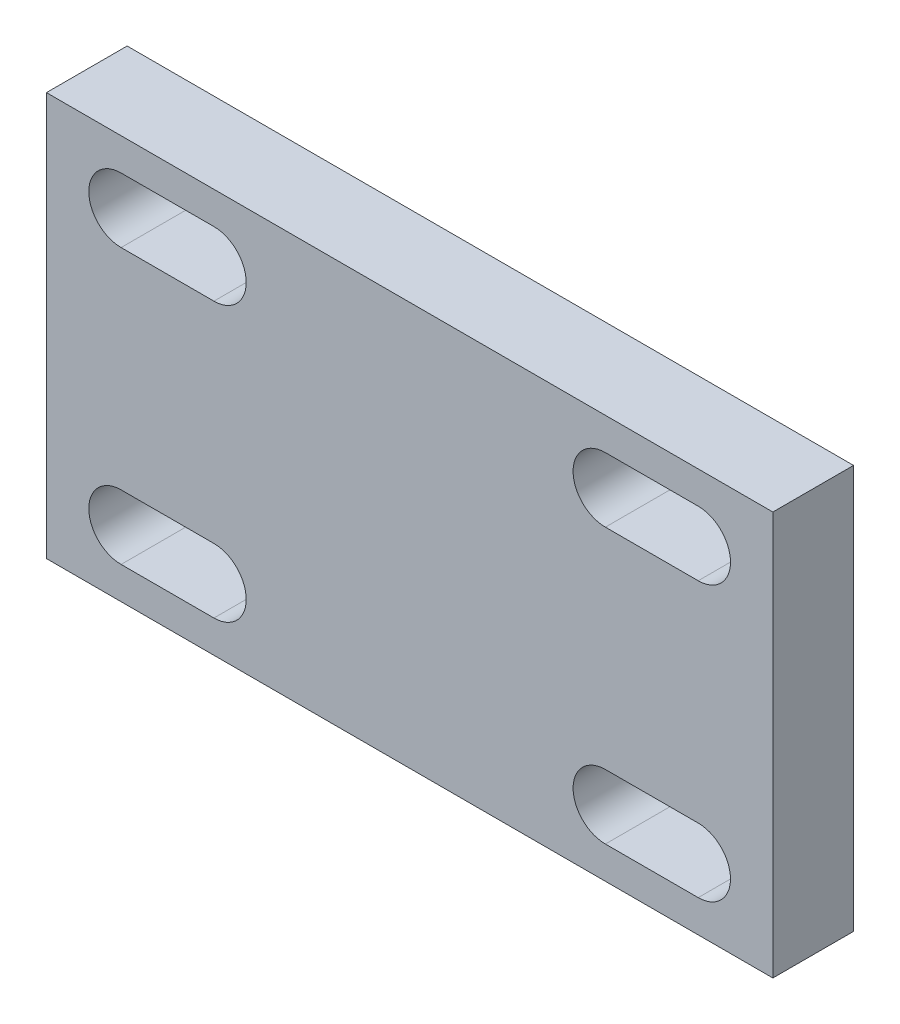
ISO-10303-21;
HEADER;
FILE_DESCRIPTION(('STEP AP214'),'2;1');
FILE_NAME('part.step','',(''),(''),'','','');
FILE_SCHEMA(('AUTOMOTIVE_DESIGN { 1 0 10303 214 1 1 1 1 }'));
ENDSEC;
DATA;
#1=APPLICATION_CONTEXT('core data for automotive mechanical design processes');
#2=APPLICATION_PROTOCOL_DEFINITION('international standard','automotive_design',2000,#1);
#3=PRODUCT_CONTEXT('',#1,'mechanical');
#4=PRODUCT('Part','Part','',(#3));
#5=PRODUCT_RELATED_PRODUCT_CATEGORY('part','',(#4));
#6=PRODUCT_DEFINITION_FORMATION('','',#4);
#7=PRODUCT_DEFINITION_CONTEXT('part definition',#1,'design');
#8=PRODUCT_DEFINITION('design','',#6,#7);
#9=PRODUCT_DEFINITION_SHAPE('','',#8);
#10=(LENGTH_UNIT() NAMED_UNIT(*) SI_UNIT(.MILLI.,.METRE.));
#11=(NAMED_UNIT(*) PLANE_ANGLE_UNIT() SI_UNIT($,.RADIAN.));
#12=(NAMED_UNIT(*) SI_UNIT($,.STERADIAN.) SOLID_ANGLE_UNIT());
#13=UNCERTAINTY_MEASURE_WITH_UNIT(LENGTH_MEASURE(1.E-05),#10,'distance_accuracy_value','');
#14=(GEOMETRIC_REPRESENTATION_CONTEXT(3) GLOBAL_UNCERTAINTY_ASSIGNED_CONTEXT((#13)) GLOBAL_UNIT_ASSIGNED_CONTEXT((#10,
#11,#12)) REPRESENTATION_CONTEXT('',''));
#15=CARTESIAN_POINT('',(0.,0.,0.));
#16=DIRECTION('',(0.,0.,1.));
#17=DIRECTION('',(1.,0.,0.));
#18=AXIS2_PLACEMENT_3D('',#15,#16,#17);
#19=CARTESIAN_POINT('',(0.,0.,10.));
#20=DIRECTION('',(0.,0.,-1.));
#21=DIRECTION('',(-1.,0.,0.));
#22=AXIS2_PLACEMENT_3D('',#19,#20,#21);
#23=PLANE('',#22);
#24=CARTESIAN_POINT('',(9.25,8.,10.));
#25=DIRECTION('',(0.,0.,1.));
#26=DIRECTION('',(1.,0.,0.));
#27=AXIS2_PLACEMENT_3D('',#24,#25,#26);
#28=CIRCLE('',#27,4.);
#29=CARTESIAN_POINT('',(9.25,12.,10.));
#30=VERTEX_POINT('',#29);
#31=CARTESIAN_POINT('',(9.25,4.,10.));
#32=VERTEX_POINT('',#31);
#33=EDGE_CURVE('E207',#30,#32,#28,.T.);
#34=ORIENTED_EDGE('',*,*,#33,.F.);
#35=DIRECTION('',(-1.,0.,0.));
#36=VECTOR('',#35,1.);
#37=CARTESIAN_POINT('',(9.25,12.,10.));
#38=LINE('',#37,#36);
#39=CARTESIAN_POINT('',(20.75,12.,10.));
#40=VERTEX_POINT('',#39);
#41=EDGE_CURVE('E215',#40,#30,#38,.T.);
#42=ORIENTED_EDGE('',*,*,#41,.F.);
#43=CARTESIAN_POINT('',(20.75,8.,10.));
#44=DIRECTION('',(0.,0.,1.));
#45=DIRECTION('',(1.,0.,0.));
#46=AXIS2_PLACEMENT_3D('',#43,#44,#45);
#47=CIRCLE('',#46,4.);
#48=CARTESIAN_POINT('',(20.75,4.,10.));
#49=VERTEX_POINT('',#48);
#50=EDGE_CURVE('E212',#49,#40,#47,.T.);
#51=ORIENTED_EDGE('',*,*,#50,.F.);
#52=DIRECTION('',(1.,0.,0.));
#53=VECTOR('',#52,1.);
#54=CARTESIAN_POINT('',(9.25,4.,10.));
#55=LINE('',#54,#53);
#56=EDGE_CURVE('E209',#32,#49,#55,.T.);
#57=ORIENTED_EDGE('',*,*,#56,.F.);
#58=EDGE_LOOP('',(#34,#42,#51,#57));
#59=FACE_BOUND('',#58,.T.);
#60=CARTESIAN_POINT('',(9.25,42.,10.));
#61=DIRECTION('',(0.,0.,1.));
#62=DIRECTION('',(1.,0.,0.));
#63=AXIS2_PLACEMENT_3D('',#60,#61,#62);
#64=CIRCLE('',#63,4.);
#65=CARTESIAN_POINT('',(9.25,46.,10.));
#66=VERTEX_POINT('',#65);
#67=CARTESIAN_POINT('',(9.25,38.,10.));
#68=VERTEX_POINT('',#67);
#69=EDGE_CURVE('E269',#66,#68,#64,.T.);
#70=ORIENTED_EDGE('',*,*,#69,.F.);
#71=DIRECTION('',(-1.,0.,0.));
#72=VECTOR('',#71,1.);
#73=CARTESIAN_POINT('',(9.25,46.,10.));
#74=LINE('',#73,#72);
#75=CARTESIAN_POINT('',(20.75,46.,10.));
#76=VERTEX_POINT('',#75);
#77=EDGE_CURVE('E277',#76,#66,#74,.T.);
#78=ORIENTED_EDGE('',*,*,#77,.F.);
#79=CARTESIAN_POINT('',(20.75,42.,10.));
#80=DIRECTION('',(0.,0.,1.));
#81=DIRECTION('',(1.,0.,0.));
#82=AXIS2_PLACEMENT_3D('',#79,#80,#81);
#83=CIRCLE('',#82,4.);
#84=CARTESIAN_POINT('',(20.75,38.,10.));
#85=VERTEX_POINT('',#84);
#86=EDGE_CURVE('E274',#85,#76,#83,.T.);
#87=ORIENTED_EDGE('',*,*,#86,.F.);
#88=DIRECTION('',(1.,0.,0.));
#89=VECTOR('',#88,1.);
#90=CARTESIAN_POINT('',(9.25,38.,10.));
#91=LINE('',#90,#89);
#92=EDGE_CURVE('E271',#68,#85,#91,.T.);
#93=ORIENTED_EDGE('',*,*,#92,.F.);
#94=EDGE_LOOP('',(#70,#78,#87,#93));
#95=FACE_BOUND('',#94,.T.);
#96=DIRECTION('',(0.,-1.,0.));
#97=VECTOR('',#96,1.);
#98=CARTESIAN_POINT('',(0.,0.,10.));
#99=LINE('',#98,#97);
#100=CARTESIAN_POINT('',(0.,50.,10.));
#101=VERTEX_POINT('',#100);
#102=CARTESIAN_POINT('',(0.,0.,10.));
#103=VERTEX_POINT('',#102);
#104=EDGE_CURVE('E300',#101,#103,#99,.T.);
#105=ORIENTED_EDGE('',*,*,#104,.T.);
#106=DIRECTION('',(1.,0.,0.));
#107=VECTOR('',#106,1.);
#108=CARTESIAN_POINT('',(0.,0.,10.));
#109=LINE('',#108,#107);
#110=CARTESIAN_POINT('',(90.,0.,10.));
#111=VERTEX_POINT('',#110);
#112=EDGE_CURVE('E303',#103,#111,#109,.T.);
#113=ORIENTED_EDGE('',*,*,#112,.T.);
#114=DIRECTION('',(0.,1.,0.));
#115=VECTOR('',#114,1.);
#116=CARTESIAN_POINT('',(90.,0.,10.));
#117=LINE('',#116,#115);
#118=CARTESIAN_POINT('',(90.,50.,10.));
#119=VERTEX_POINT('',#118);
#120=EDGE_CURVE('E306',#111,#119,#117,.T.);
#121=ORIENTED_EDGE('',*,*,#120,.T.);
#122=DIRECTION('',(-1.,0.,0.));
#123=VECTOR('',#122,1.);
#124=CARTESIAN_POINT('',(0.,50.,10.));
#125=LINE('',#124,#123);
#126=EDGE_CURVE('E308',#119,#101,#125,.T.);
#127=ORIENTED_EDGE('',*,*,#126,.T.);
#128=EDGE_LOOP('',(#105,#113,#121,#127));
#129=FACE_BOUND('',#128,.T.);
#130=CARTESIAN_POINT('',(80.75,42.,10.));
#131=DIRECTION('',(0.,0.,1.));
#132=DIRECTION('',(1.,0.,0.));
#133=AXIS2_PLACEMENT_3D('',#130,#131,#132);
#134=CIRCLE('',#133,4.);
#135=CARTESIAN_POINT('',(80.75,38.,10.));
#136=VERTEX_POINT('',#135);
#137=CARTESIAN_POINT('',(80.75,46.,10.));
#138=VERTEX_POINT('',#137);
#139=EDGE_CURVE('E238',#136,#138,#134,.T.);
#140=ORIENTED_EDGE('',*,*,#139,.F.);
#141=DIRECTION('',(1.,0.,0.));
#142=VECTOR('',#141,1.);
#143=CARTESIAN_POINT('',(80.75,38.,10.));
#144=LINE('',#143,#142);
#145=CARTESIAN_POINT('',(69.25,38.,10.));
#146=VERTEX_POINT('',#145);
#147=EDGE_CURVE('E246',#146,#136,#144,.T.);
#148=ORIENTED_EDGE('',*,*,#147,.F.);
#149=CARTESIAN_POINT('',(69.25,42.,10.));
#150=DIRECTION('',(0.,0.,1.));
#151=DIRECTION('',(1.,0.,0.));
#152=AXIS2_PLACEMENT_3D('',#149,#150,#151);
#153=CIRCLE('',#152,4.);
#154=CARTESIAN_POINT('',(69.25,46.,10.));
#155=VERTEX_POINT('',#154);
#156=EDGE_CURVE('E243',#155,#146,#153,.T.);
#157=ORIENTED_EDGE('',*,*,#156,.F.);
#158=DIRECTION('',(-1.,0.,0.));
#159=VECTOR('',#158,1.);
#160=CARTESIAN_POINT('',(80.75,46.,10.));
#161=LINE('',#160,#159);
#162=EDGE_CURVE('E240',#138,#155,#161,.T.);
#163=ORIENTED_EDGE('',*,*,#162,.F.);
#164=EDGE_LOOP('',(#140,#148,#157,#163));
#165=FACE_BOUND('',#164,.T.);
#166=CARTESIAN_POINT('',(69.25,7.99999999999999,10.));
#167=DIRECTION('',(0.,0.,1.));
#168=DIRECTION('',(1.,0.,0.));
#169=AXIS2_PLACEMENT_3D('',#166,#167,#168);
#170=CIRCLE('',#169,4.);
#171=CARTESIAN_POINT('',(69.25,12.,10.));
#172=VERTEX_POINT('',#171);
#173=CARTESIAN_POINT('',(69.25,3.99999999999998,10.));
#174=VERTEX_POINT('',#173);
#175=EDGE_CURVE('E171',#172,#174,#170,.T.);
#176=ORIENTED_EDGE('',*,*,#175,.F.);
#177=DIRECTION('',(-1.,0.,0.));
#178=VECTOR('',#177,1.);
#179=CARTESIAN_POINT('',(69.25,12.,10.));
#180=LINE('',#179,#178);
#181=CARTESIAN_POINT('',(80.75,12.,10.));
#182=VERTEX_POINT('',#181);
#183=EDGE_CURVE('E193',#182,#172,#180,.T.);
#184=ORIENTED_EDGE('',*,*,#183,.F.);
#185=CARTESIAN_POINT('',(80.75,7.99999999999998,10.));
#186=DIRECTION('',(0.,0.,1.));
#187=DIRECTION('',(1.,0.,0.));
#188=AXIS2_PLACEMENT_3D('',#185,#186,#187);
#189=CIRCLE('',#188,4.);
#190=CARTESIAN_POINT('',(80.75,3.99999999999998,10.));
#191=VERTEX_POINT('',#190);
#192=EDGE_CURVE('E191',#191,#182,#189,.T.);
#193=ORIENTED_EDGE('',*,*,#192,.F.);
#194=DIRECTION('',(1.,0.,0.));
#195=VECTOR('',#194,1.);
#196=CARTESIAN_POINT('',(69.25,3.99999999999998,10.));
#197=LINE('',#196,#195);
#198=EDGE_CURVE('E179',#174,#191,#197,.T.);
#199=ORIENTED_EDGE('',*,*,#198,.F.);
#200=EDGE_LOOP('',(#176,#184,#193,#199));
#201=FACE_BOUND('',#200,.T.);
#202=ADVANCED_FACE('F34',(#59,#95,#129,#165,#201),#23,.F.);
#203=CARTESIAN_POINT('',(0.,0.,0.));
#204=DIRECTION('',(0.,0.,-1.));
#205=DIRECTION('',(-1.,0.,0.));
#206=AXIS2_PLACEMENT_3D('',#203,#204,#205);
#207=PLANE('',#206);
#208=DIRECTION('',(0.,-1.,0.));
#209=VECTOR('',#208,1.);
#210=CARTESIAN_POINT('',(0.,0.,0.));
#211=LINE('',#210,#209);
#212=CARTESIAN_POINT('',(0.,50.,0.));
#213=VERTEX_POINT('',#212);
#214=CARTESIAN_POINT('',(0.,0.,0.));
#215=VERTEX_POINT('',#214);
#216=EDGE_CURVE('E299',#213,#215,#211,.T.);
#217=ORIENTED_EDGE('',*,*,#216,.F.);
#218=DIRECTION('',(-1.,0.,0.));
#219=VECTOR('',#218,1.);
#220=CARTESIAN_POINT('',(0.,50.,0.));
#221=LINE('',#220,#219);
#222=CARTESIAN_POINT('',(90.,50.,0.));
#223=VERTEX_POINT('',#222);
#224=EDGE_CURVE('E304',#223,#213,#221,.T.);
#225=ORIENTED_EDGE('',*,*,#224,.F.);
#226=DIRECTION('',(0.,1.,0.));
#227=VECTOR('',#226,1.);
#228=CARTESIAN_POINT('',(90.,0.,0.));
#229=LINE('',#228,#227);
#230=CARTESIAN_POINT('',(90.,0.,0.));
#231=VERTEX_POINT('',#230);
#232=EDGE_CURVE('E315',#231,#223,#229,.T.);
#233=ORIENTED_EDGE('',*,*,#232,.F.);
#234=DIRECTION('',(1.,0.,0.));
#235=VECTOR('',#234,1.);
#236=CARTESIAN_POINT('',(0.,0.,0.));
#237=LINE('',#236,#235);
#238=EDGE_CURVE('E313',#215,#231,#237,.T.);
#239=ORIENTED_EDGE('',*,*,#238,.F.);
#240=EDGE_LOOP('',(#217,#225,#233,#239));
#241=FACE_BOUND('',#240,.T.);
#242=DIRECTION('',(-1.,0.,0.));
#243=VECTOR('',#242,1.);
#244=CARTESIAN_POINT('',(9.25,46.,0.));
#245=LINE('',#244,#243);
#246=CARTESIAN_POINT('',(20.75,46.,0.));
#247=VERTEX_POINT('',#246);
#248=CARTESIAN_POINT('',(9.25,46.,0.));
#249=VERTEX_POINT('',#248);
#250=EDGE_CURVE('E272',#247,#249,#245,.T.);
#251=ORIENTED_EDGE('',*,*,#250,.T.);
#252=CARTESIAN_POINT('',(9.25,42.,0.));
#253=DIRECTION('',(0.,0.,1.));
#254=DIRECTION('',(1.,0.,0.));
#255=AXIS2_PLACEMENT_3D('',#252,#253,#254);
#256=CIRCLE('',#255,4.);
#257=CARTESIAN_POINT('',(9.25,38.,0.));
#258=VERTEX_POINT('',#257);
#259=EDGE_CURVE('E268',#249,#258,#256,.T.);
#260=ORIENTED_EDGE('',*,*,#259,.T.);
#261=DIRECTION('',(1.,0.,0.));
#262=VECTOR('',#261,1.);
#263=CARTESIAN_POINT('',(9.25,38.,0.));
#264=LINE('',#263,#262);
#265=CARTESIAN_POINT('',(20.75,38.,0.));
#266=VERTEX_POINT('',#265);
#267=EDGE_CURVE('E282',#258,#266,#264,.T.);
#268=ORIENTED_EDGE('',*,*,#267,.T.);
#269=CARTESIAN_POINT('',(20.75,42.,0.));
#270=DIRECTION('',(0.,0.,1.));
#271=DIRECTION('',(1.,0.,0.));
#272=AXIS2_PLACEMENT_3D('',#269,#270,#271);
#273=CIRCLE('',#272,4.);
#274=EDGE_CURVE('E285',#266,#247,#273,.T.);
#275=ORIENTED_EDGE('',*,*,#274,.T.);
#276=EDGE_LOOP('',(#251,#260,#268,#275));
#277=FACE_BOUND('',#276,.T.);
#278=DIRECTION('',(1.,0.,0.));
#279=VECTOR('',#278,1.);
#280=CARTESIAN_POINT('',(80.75,38.,0.));
#281=LINE('',#280,#279);
#282=CARTESIAN_POINT('',(69.25,38.,0.));
#283=VERTEX_POINT('',#282);
#284=CARTESIAN_POINT('',(80.75,38.,0.));
#285=VERTEX_POINT('',#284);
#286=EDGE_CURVE('E241',#283,#285,#281,.T.);
#287=ORIENTED_EDGE('',*,*,#286,.T.);
#288=CARTESIAN_POINT('',(80.75,42.,0.));
#289=DIRECTION('',(0.,0.,1.));
#290=DIRECTION('',(1.,0.,0.));
#291=AXIS2_PLACEMENT_3D('',#288,#289,#290);
#292=CIRCLE('',#291,4.);
#293=CARTESIAN_POINT('',(80.75,46.,0.));
#294=VERTEX_POINT('',#293);
#295=EDGE_CURVE('E237',#285,#294,#292,.T.);
#296=ORIENTED_EDGE('',*,*,#295,.T.);
#297=DIRECTION('',(-1.,0.,0.));
#298=VECTOR('',#297,1.);
#299=CARTESIAN_POINT('',(80.75,46.,0.));
#300=LINE('',#299,#298);
#301=CARTESIAN_POINT('',(69.25,46.,0.));
#302=VERTEX_POINT('',#301);
#303=EDGE_CURVE('E251',#294,#302,#300,.T.);
#304=ORIENTED_EDGE('',*,*,#303,.T.);
#305=CARTESIAN_POINT('',(69.25,42.,0.));
#306=DIRECTION('',(0.,0.,1.));
#307=DIRECTION('',(1.,0.,0.));
#308=AXIS2_PLACEMENT_3D('',#305,#306,#307);
#309=CIRCLE('',#308,4.);
#310=EDGE_CURVE('E254',#302,#283,#309,.T.);
#311=ORIENTED_EDGE('',*,*,#310,.T.);
#312=EDGE_LOOP('',(#287,#296,#304,#311));
#313=FACE_BOUND('',#312,.T.);
#314=DIRECTION('',(-1.,0.,0.));
#315=VECTOR('',#314,1.);
#316=CARTESIAN_POINT('',(9.25,12.,0.));
#317=LINE('',#316,#315);
#318=CARTESIAN_POINT('',(20.75,12.,0.));
#319=VERTEX_POINT('',#318);
#320=CARTESIAN_POINT('',(9.25,12.,0.));
#321=VERTEX_POINT('',#320);
#322=EDGE_CURVE('E210',#319,#321,#317,.T.);
#323=ORIENTED_EDGE('',*,*,#322,.T.);
#324=CARTESIAN_POINT('',(9.25,8.,0.));
#325=DIRECTION('',(0.,0.,1.));
#326=DIRECTION('',(1.,0.,0.));
#327=AXIS2_PLACEMENT_3D('',#324,#325,#326);
#328=CIRCLE('',#327,4.);
#329=CARTESIAN_POINT('',(9.25,4.,0.));
#330=VERTEX_POINT('',#329);
#331=EDGE_CURVE('E187',#321,#330,#328,.T.);
#332=ORIENTED_EDGE('',*,*,#331,.T.);
#333=DIRECTION('',(1.,0.,0.));
#334=VECTOR('',#333,1.);
#335=CARTESIAN_POINT('',(9.25,4.,0.));
#336=LINE('',#335,#334);
#337=CARTESIAN_POINT('',(20.75,4.,0.));
#338=VERTEX_POINT('',#337);
#339=EDGE_CURVE('E220',#330,#338,#336,.T.);
#340=ORIENTED_EDGE('',*,*,#339,.T.);
#341=CARTESIAN_POINT('',(20.75,8.,0.));
#342=DIRECTION('',(0.,0.,1.));
#343=DIRECTION('',(1.,0.,0.));
#344=AXIS2_PLACEMENT_3D('',#341,#342,#343);
#345=CIRCLE('',#344,4.);
#346=EDGE_CURVE('E223',#338,#319,#345,.T.);
#347=ORIENTED_EDGE('',*,*,#346,.T.);
#348=EDGE_LOOP('',(#323,#332,#340,#347));
#349=FACE_BOUND('',#348,.T.);
#350=DIRECTION('',(-1.,0.,0.));
#351=VECTOR('',#350,1.);
#352=CARTESIAN_POINT('',(69.25,12.,0.));
#353=LINE('',#352,#351);
#354=CARTESIAN_POINT('',(80.75,12.,0.));
#355=VERTEX_POINT('',#354);
#356=CARTESIAN_POINT('',(69.25,12.,0.));
#357=VERTEX_POINT('',#356);
#358=EDGE_CURVE('E180',#355,#357,#353,.T.);
#359=ORIENTED_EDGE('',*,*,#358,.T.);
#360=CARTESIAN_POINT('',(69.25,7.99999999999999,0.));
#361=DIRECTION('',(0.,0.,1.));
#362=DIRECTION('',(1.,0.,0.));
#363=AXIS2_PLACEMENT_3D('',#360,#361,#362);
#364=CIRCLE('',#363,4.);
#365=CARTESIAN_POINT('',(69.25,3.99999999999998,0.));
#366=VERTEX_POINT('',#365);
#367=EDGE_CURVE('E57',#357,#366,#364,.T.);
#368=ORIENTED_EDGE('',*,*,#367,.T.);
#369=DIRECTION('',(1.,0.,0.));
#370=VECTOR('',#369,1.);
#371=CARTESIAN_POINT('',(69.25,3.99999999999998,0.));
#372=LINE('',#371,#370);
#373=CARTESIAN_POINT('',(80.75,3.99999999999998,0.));
#374=VERTEX_POINT('',#373);
#375=EDGE_CURVE('E186',#366,#374,#372,.T.);
#376=ORIENTED_EDGE('',*,*,#375,.T.);
#377=CARTESIAN_POINT('',(80.75,7.99999999999998,0.));
#378=DIRECTION('',(0.,0.,1.));
#379=DIRECTION('',(1.,0.,0.));
#380=AXIS2_PLACEMENT_3D('',#377,#378,#379);
#381=CIRCLE('',#380,4.);
#382=EDGE_CURVE('E199',#374,#355,#381,.T.);
#383=ORIENTED_EDGE('',*,*,#382,.T.);
#384=EDGE_LOOP('',(#359,#368,#376,#383));
#385=FACE_BOUND('',#384,.T.);
#386=ADVANCED_FACE('F333',(#241,#277,#313,#349,#385),#207,.T.);
#387=CARTESIAN_POINT('',(0.,0.,10.));
#388=DIRECTION('',(1.,0.,0.));
#389=DIRECTION('',(0.,0.,-1.));
#390=AXIS2_PLACEMENT_3D('',#387,#388,#389);
#391=PLANE('',#390);
#392=ORIENTED_EDGE('',*,*,#216,.T.);
#393=DIRECTION('',(0.,0.,-1.));
#394=VECTOR('',#393,1.);
#395=CARTESIAN_POINT('',(0.,0.,10.));
#396=LINE('',#395,#394);
#397=EDGE_CURVE('E11',#103,#215,#396,.T.);
#398=ORIENTED_EDGE('',*,*,#397,.F.);
#399=ORIENTED_EDGE('',*,*,#104,.F.);
#400=DIRECTION('',(0.,0.,-1.));
#401=VECTOR('',#400,1.);
#402=CARTESIAN_POINT('',(0.,50.,10.));
#403=LINE('',#402,#401);
#404=EDGE_CURVE('E310',#101,#213,#403,.T.);
#405=ORIENTED_EDGE('',*,*,#404,.T.);
#406=EDGE_LOOP('',(#392,#398,#399,#405));
#407=FACE_BOUND('',#406,.T.);
#408=ADVANCED_FACE('F36',(#407),#391,.F.);
#409=CARTESIAN_POINT('',(0.,0.,10.));
#410=DIRECTION('',(0.,1.,0.));
#411=DIRECTION('',(0.,0.,1.));
#412=AXIS2_PLACEMENT_3D('',#409,#410,#411);
#413=PLANE('',#412);
#414=ORIENTED_EDGE('',*,*,#238,.T.);
#415=DIRECTION('',(0.,0.,-1.));
#416=VECTOR('',#415,1.);
#417=CARTESIAN_POINT('',(90.,0.,10.));
#418=LINE('',#417,#416);
#419=EDGE_CURVE('E42',#111,#231,#418,.T.);
#420=ORIENTED_EDGE('',*,*,#419,.F.);
#421=ORIENTED_EDGE('',*,*,#112,.F.);
#422=ORIENTED_EDGE('',*,*,#397,.T.);
#423=EDGE_LOOP('',(#414,#420,#421,#422));
#424=FACE_BOUND('',#423,.T.);
#425=ADVANCED_FACE('F344',(#424),#413,.F.);
#426=CARTESIAN_POINT('',(90.,0.,10.));
#427=DIRECTION('',(-1.,0.,0.));
#428=DIRECTION('',(0.,0.,1.));
#429=AXIS2_PLACEMENT_3D('',#426,#427,#428);
#430=PLANE('',#429);
#431=ORIENTED_EDGE('',*,*,#232,.T.);
#432=DIRECTION('',(0.,0.,-1.));
#433=VECTOR('',#432,1.);
#434=CARTESIAN_POINT('',(90.,50.,10.));
#435=LINE('',#434,#433);
#436=EDGE_CURVE('E320',#119,#223,#435,.T.);
#437=ORIENTED_EDGE('',*,*,#436,.F.);
#438=ORIENTED_EDGE('',*,*,#120,.F.);
#439=ORIENTED_EDGE('',*,*,#419,.T.);
#440=EDGE_LOOP('',(#431,#437,#438,#439));
#441=FACE_BOUND('',#440,.T.);
#442=ADVANCED_FACE('F327',(#441),#430,.F.);
#443=CARTESIAN_POINT('',(0.,50.,10.));
#444=DIRECTION('',(0.,-1.,0.));
#445=DIRECTION('',(0.,0.,-1.));
#446=AXIS2_PLACEMENT_3D('',#443,#444,#445);
#447=PLANE('',#446);
#448=ORIENTED_EDGE('',*,*,#224,.T.);
#449=ORIENTED_EDGE('',*,*,#404,.F.);
#450=ORIENTED_EDGE('',*,*,#126,.F.);
#451=ORIENTED_EDGE('',*,*,#436,.T.);
#452=EDGE_LOOP('',(#448,#449,#450,#451));
#453=FACE_BOUND('',#452,.T.);
#454=ADVANCED_FACE('F337',(#453),#447,.F.);
#455=CARTESIAN_POINT('',(9.25,42.,10.));
#456=DIRECTION('',(0.,0.,-1.));
#457=DIRECTION('',(-1.,0.,0.));
#458=AXIS2_PLACEMENT_3D('',#455,#456,#457);
#459=CYLINDRICAL_SURFACE('',#458,4.);
#460=ORIENTED_EDGE('',*,*,#259,.F.);
#461=DIRECTION('',(0.,0.,-1.));
#462=VECTOR('',#461,1.);
#463=CARTESIAN_POINT('',(9.25,46.,10.));
#464=LINE('',#463,#462);
#465=EDGE_CURVE('E279',#66,#249,#464,.T.);
#466=ORIENTED_EDGE('',*,*,#465,.F.);
#467=ORIENTED_EDGE('',*,*,#69,.T.);
#468=DIRECTION('',(0.,0.,-1.));
#469=VECTOR('',#468,1.);
#470=CARTESIAN_POINT('',(9.25,38.,10.));
#471=LINE('',#470,#469);
#472=EDGE_CURVE('E296',#68,#258,#471,.T.);
#473=ORIENTED_EDGE('',*,*,#472,.T.);
#474=EDGE_LOOP('',(#460,#466,#467,#473));
#475=FACE_BOUND('',#474,.T.);
#476=ADVANCED_FACE('F361',(#475),#459,.F.);
#477=CARTESIAN_POINT('',(9.25,38.,10.));
#478=DIRECTION('',(0.,1.,0.));
#479=DIRECTION('',(0.,0.,1.));
#480=AXIS2_PLACEMENT_3D('',#477,#478,#479);
#481=PLANE('',#480);
#482=ORIENTED_EDGE('',*,*,#267,.F.);
#483=ORIENTED_EDGE('',*,*,#472,.F.);
#484=ORIENTED_EDGE('',*,*,#92,.T.);
#485=DIRECTION('',(0.,0.,-1.));
#486=VECTOR('',#485,1.);
#487=CARTESIAN_POINT('',(20.75,38.,10.));
#488=LINE('',#487,#486);
#489=EDGE_CURVE('E294',#85,#266,#488,.T.);
#490=ORIENTED_EDGE('',*,*,#489,.T.);
#491=EDGE_LOOP('',(#482,#483,#484,#490));
#492=FACE_BOUND('',#491,.T.);
#493=ADVANCED_FACE('F368',(#492),#481,.T.);
#494=CARTESIAN_POINT('',(20.75,42.,10.));
#495=DIRECTION('',(0.,0.,-1.));
#496=DIRECTION('',(-1.,0.,0.));
#497=AXIS2_PLACEMENT_3D('',#494,#495,#496);
#498=CYLINDRICAL_SURFACE('',#497,4.);
#499=ORIENTED_EDGE('',*,*,#274,.F.);
#500=ORIENTED_EDGE('',*,*,#489,.F.);
#501=ORIENTED_EDGE('',*,*,#86,.T.);
#502=DIRECTION('',(0.,0.,-1.));
#503=VECTOR('',#502,1.);
#504=CARTESIAN_POINT('',(20.75,46.,10.));
#505=LINE('',#504,#503);
#506=EDGE_CURVE('E292',#76,#247,#505,.T.);
#507=ORIENTED_EDGE('',*,*,#506,.T.);
#508=EDGE_LOOP('',(#499,#500,#501,#507));
#509=FACE_BOUND('',#508,.T.);
#510=ADVANCED_FACE('F373',(#509),#498,.F.);
#511=CARTESIAN_POINT('',(9.25,46.,10.));
#512=DIRECTION('',(0.,-1.,0.));
#513=DIRECTION('',(0.,0.,-1.));
#514=AXIS2_PLACEMENT_3D('',#511,#512,#513);
#515=PLANE('',#514);
#516=ORIENTED_EDGE('',*,*,#250,.F.);
#517=ORIENTED_EDGE('',*,*,#506,.F.);
#518=ORIENTED_EDGE('',*,*,#77,.T.);
#519=ORIENTED_EDGE('',*,*,#465,.T.);
#520=EDGE_LOOP('',(#516,#517,#518,#519));
#521=FACE_BOUND('',#520,.T.);
#522=ADVANCED_FACE('F380',(#521),#515,.T.);
#523=CARTESIAN_POINT('',(80.75,42.,10.));
#524=DIRECTION('',(0.,0.,-1.));
#525=DIRECTION('',(-1.,0.,0.));
#526=AXIS2_PLACEMENT_3D('',#523,#524,#525);
#527=CYLINDRICAL_SURFACE('',#526,4.);
#528=ORIENTED_EDGE('',*,*,#295,.F.);
#529=DIRECTION('',(0.,0.,-1.));
#530=VECTOR('',#529,1.);
#531=CARTESIAN_POINT('',(80.75,38.,10.));
#532=LINE('',#531,#530);
#533=EDGE_CURVE('E248',#136,#285,#532,.T.);
#534=ORIENTED_EDGE('',*,*,#533,.F.);
#535=ORIENTED_EDGE('',*,*,#139,.T.);
#536=DIRECTION('',(0.,0.,-1.));
#537=VECTOR('',#536,1.);
#538=CARTESIAN_POINT('',(80.75,46.,10.));
#539=LINE('',#538,#537);
#540=EDGE_CURVE('E265',#138,#294,#539,.T.);
#541=ORIENTED_EDGE('',*,*,#540,.T.);
#542=EDGE_LOOP('',(#528,#534,#535,#541));
#543=FACE_BOUND('',#542,.T.);
#544=ADVANCED_FACE('F393',(#543),#527,.F.);
#545=CARTESIAN_POINT('',(80.75,46.,10.));
#546=DIRECTION('',(0.,-1.,0.));
#547=DIRECTION('',(0.,0.,-1.));
#548=AXIS2_PLACEMENT_3D('',#545,#546,#547);
#549=PLANE('',#548);
#550=ORIENTED_EDGE('',*,*,#303,.F.);
#551=ORIENTED_EDGE('',*,*,#540,.F.);
#552=ORIENTED_EDGE('',*,*,#162,.T.);
#553=DIRECTION('',(0.,0.,-1.));
#554=VECTOR('',#553,1.);
#555=CARTESIAN_POINT('',(69.25,46.,10.));
#556=LINE('',#555,#554);
#557=EDGE_CURVE('E263',#155,#302,#556,.T.);
#558=ORIENTED_EDGE('',*,*,#557,.T.);
#559=EDGE_LOOP('',(#550,#551,#552,#558));
#560=FACE_BOUND('',#559,.T.);
#561=ADVANCED_FACE('F398',(#560),#549,.T.);
#562=CARTESIAN_POINT('',(69.25,42.,10.));
#563=DIRECTION('',(0.,0.,-1.));
#564=DIRECTION('',(-1.,0.,0.));
#565=AXIS2_PLACEMENT_3D('',#562,#563,#564);
#566=CYLINDRICAL_SURFACE('',#565,4.);
#567=ORIENTED_EDGE('',*,*,#310,.F.);
#568=ORIENTED_EDGE('',*,*,#557,.F.);
#569=ORIENTED_EDGE('',*,*,#156,.T.);
#570=DIRECTION('',(0.,0.,-1.));
#571=VECTOR('',#570,1.);
#572=CARTESIAN_POINT('',(69.25,38.,10.));
#573=LINE('',#572,#571);
#574=EDGE_CURVE('E261',#146,#283,#573,.T.);
#575=ORIENTED_EDGE('',*,*,#574,.T.);
#576=EDGE_LOOP('',(#567,#568,#569,#575));
#577=FACE_BOUND('',#576,.T.);
#578=ADVANCED_FACE('F402',(#577),#566,.F.);
#579=CARTESIAN_POINT('',(80.75,38.,10.));
#580=DIRECTION('',(0.,1.,0.));
#581=DIRECTION('',(0.,0.,1.));
#582=AXIS2_PLACEMENT_3D('',#579,#580,#581);
#583=PLANE('',#582);
#584=ORIENTED_EDGE('',*,*,#286,.F.);
#585=ORIENTED_EDGE('',*,*,#574,.F.);
#586=ORIENTED_EDGE('',*,*,#147,.T.);
#587=ORIENTED_EDGE('',*,*,#533,.T.);
#588=EDGE_LOOP('',(#584,#585,#586,#587));
#589=FACE_BOUND('',#588,.T.);
#590=ADVANCED_FACE('F406',(#589),#583,.T.);
#591=CARTESIAN_POINT('',(9.25,8.,10.));
#592=DIRECTION('',(0.,0.,-1.));
#593=DIRECTION('',(-1.,0.,0.));
#594=AXIS2_PLACEMENT_3D('',#591,#592,#593);
#595=CYLINDRICAL_SURFACE('',#594,4.);
#596=ORIENTED_EDGE('',*,*,#331,.F.);
#597=DIRECTION('',(0.,0.,-1.));
#598=VECTOR('',#597,1.);
#599=CARTESIAN_POINT('',(9.25,12.,10.));
#600=LINE('',#599,#598);
#601=EDGE_CURVE('E217',#30,#321,#600,.T.);
#602=ORIENTED_EDGE('',*,*,#601,.F.);
#603=ORIENTED_EDGE('',*,*,#33,.T.);
#604=DIRECTION('',(0.,0.,-1.));
#605=VECTOR('',#604,1.);
#606=CARTESIAN_POINT('',(9.25,4.,10.));
#607=LINE('',#606,#605);
#608=EDGE_CURVE('E234',#32,#330,#607,.T.);
#609=ORIENTED_EDGE('',*,*,#608,.T.);
#610=EDGE_LOOP('',(#596,#602,#603,#609));
#611=FACE_BOUND('',#610,.T.);
#612=ADVANCED_FACE('F410',(#611),#595,.F.);
#613=CARTESIAN_POINT('',(9.25,4.,10.));
#614=DIRECTION('',(0.,1.,0.));
#615=DIRECTION('',(0.,0.,1.));
#616=AXIS2_PLACEMENT_3D('',#613,#614,#615);
#617=PLANE('',#616);
#618=ORIENTED_EDGE('',*,*,#339,.F.);
#619=ORIENTED_EDGE('',*,*,#608,.F.);
#620=ORIENTED_EDGE('',*,*,#56,.T.);
#621=DIRECTION('',(0.,0.,-1.));
#622=VECTOR('',#621,1.);
#623=CARTESIAN_POINT('',(20.75,4.,10.));
#624=LINE('',#623,#622);
#625=EDGE_CURVE('E232',#49,#338,#624,.T.);
#626=ORIENTED_EDGE('',*,*,#625,.T.);
#627=EDGE_LOOP('',(#618,#619,#620,#626));
#628=FACE_BOUND('',#627,.T.);
#629=ADVANCED_FACE('F414',(#628),#617,.T.);
#630=CARTESIAN_POINT('',(20.75,8.,10.));
#631=DIRECTION('',(0.,0.,-1.));
#632=DIRECTION('',(-1.,0.,0.));
#633=AXIS2_PLACEMENT_3D('',#630,#631,#632);
#634=CYLINDRICAL_SURFACE('',#633,4.);
#635=ORIENTED_EDGE('',*,*,#346,.F.);
#636=ORIENTED_EDGE('',*,*,#625,.F.);
#637=ORIENTED_EDGE('',*,*,#50,.T.);
#638=DIRECTION('',(0.,0.,-1.));
#639=VECTOR('',#638,1.);
#640=CARTESIAN_POINT('',(20.75,12.,10.));
#641=LINE('',#640,#639);
#642=EDGE_CURVE('E230',#40,#319,#641,.T.);
#643=ORIENTED_EDGE('',*,*,#642,.T.);
#644=EDGE_LOOP('',(#635,#636,#637,#643));
#645=FACE_BOUND('',#644,.T.);
#646=ADVANCED_FACE('F418',(#645),#634,.F.);
#647=CARTESIAN_POINT('',(9.25,12.,10.));
#648=DIRECTION('',(0.,-1.,0.));
#649=DIRECTION('',(0.,0.,-1.));
#650=AXIS2_PLACEMENT_3D('',#647,#648,#649);
#651=PLANE('',#650);
#652=ORIENTED_EDGE('',*,*,#322,.F.);
#653=ORIENTED_EDGE('',*,*,#642,.F.);
#654=ORIENTED_EDGE('',*,*,#41,.T.);
#655=ORIENTED_EDGE('',*,*,#601,.T.);
#656=EDGE_LOOP('',(#652,#653,#654,#655));
#657=FACE_BOUND('',#656,.T.);
#658=ADVANCED_FACE('F422',(#657),#651,.T.);
#659=CARTESIAN_POINT('',(69.25,7.99999999999999,10.));
#660=DIRECTION('',(0.,0.,-1.));
#661=DIRECTION('',(-1.,0.,0.));
#662=AXIS2_PLACEMENT_3D('',#659,#660,#661);
#663=CYLINDRICAL_SURFACE('',#662,4.);
#664=ORIENTED_EDGE('',*,*,#367,.F.);
#665=DIRECTION('',(0.,0.,-1.));
#666=VECTOR('',#665,1.);
#667=CARTESIAN_POINT('',(69.25,12.,10.));
#668=LINE('',#667,#666);
#669=EDGE_CURVE('E175',#172,#357,#668,.T.);
#670=ORIENTED_EDGE('',*,*,#669,.F.);
#671=ORIENTED_EDGE('',*,*,#175,.T.);
#672=DIRECTION('',(0.,0.,-1.));
#673=VECTOR('',#672,1.);
#674=CARTESIAN_POINT('',(69.25,3.99999999999998,10.));
#675=LINE('',#674,#673);
#676=EDGE_CURVE('E174',#174,#366,#675,.T.);
#677=ORIENTED_EDGE('',*,*,#676,.T.);
#678=EDGE_LOOP('',(#664,#670,#671,#677));
#679=FACE_BOUND('',#678,.T.);
#680=ADVANCED_FACE('F173',(#679),#663,.F.);
#681=CARTESIAN_POINT('',(69.25,3.99999999999998,10.));
#682=DIRECTION('',(0.,1.,0.));
#683=DIRECTION('',(0.,0.,1.));
#684=AXIS2_PLACEMENT_3D('',#681,#682,#683);
#685=PLANE('',#684);
#686=ORIENTED_EDGE('',*,*,#375,.F.);
#687=ORIENTED_EDGE('',*,*,#676,.F.);
#688=ORIENTED_EDGE('',*,*,#198,.T.);
#689=DIRECTION('',(0.,0.,-1.));
#690=VECTOR('',#689,1.);
#691=CARTESIAN_POINT('',(80.75,3.99999999999998,10.));
#692=LINE('',#691,#690);
#693=EDGE_CURVE('E188',#191,#374,#692,.T.);
#694=ORIENTED_EDGE('',*,*,#693,.T.);
#695=EDGE_LOOP('',(#686,#687,#688,#694));
#696=FACE_BOUND('',#695,.T.);
#697=ADVANCED_FACE('F183',(#696),#685,.T.);
#698=CARTESIAN_POINT('',(80.75,7.99999999999998,10.));
#699=DIRECTION('',(0.,0.,-1.));
#700=DIRECTION('',(-1.,0.,0.));
#701=AXIS2_PLACEMENT_3D('',#698,#699,#700);
#702=CYLINDRICAL_SURFACE('',#701,4.);
#703=ORIENTED_EDGE('',*,*,#382,.F.);
#704=ORIENTED_EDGE('',*,*,#693,.F.);
#705=ORIENTED_EDGE('',*,*,#192,.T.);
#706=DIRECTION('',(0.,0.,-1.));
#707=VECTOR('',#706,1.);
#708=CARTESIAN_POINT('',(80.75,12.,10.));
#709=LINE('',#708,#707);
#710=EDGE_CURVE('E49',#182,#355,#709,.T.);
#711=ORIENTED_EDGE('',*,*,#710,.T.);
#712=EDGE_LOOP('',(#703,#704,#705,#711));
#713=FACE_BOUND('',#712,.T.);
#714=ADVANCED_FACE('F431',(#713),#702,.F.);
#715=CARTESIAN_POINT('',(69.25,12.,10.));
#716=DIRECTION('',(0.,-1.,0.));
#717=DIRECTION('',(1.,0.,0.));
#718=AXIS2_PLACEMENT_3D('',#715,#716,#717);
#719=PLANE('',#718);
#720=ORIENTED_EDGE('',*,*,#358,.F.);
#721=ORIENTED_EDGE('',*,*,#710,.F.);
#722=ORIENTED_EDGE('',*,*,#183,.T.);
#723=ORIENTED_EDGE('',*,*,#669,.T.);
#724=EDGE_LOOP('',(#720,#721,#722,#723));
#725=FACE_BOUND('',#724,.T.);
#726=ADVANCED_FACE('F434',(#725),#719,.T.);
#727=CLOSED_SHELL('',(#202,#386,#408,#425,#442,#454,#476,#493,#510,#522,#544,#561,#578,#590,
#612,#629,#646,#658,#680,#697,#714,#726));
#728=MANIFOLD_SOLID_BREP('B2',#727);
#729=ADVANCED_BREP_SHAPE_REPRESENTATION('',(#18,#728),#14);
#730=SHAPE_DEFINITION_REPRESENTATION(#9,#729);
ENDSEC;
END-ISO-10303-21;
